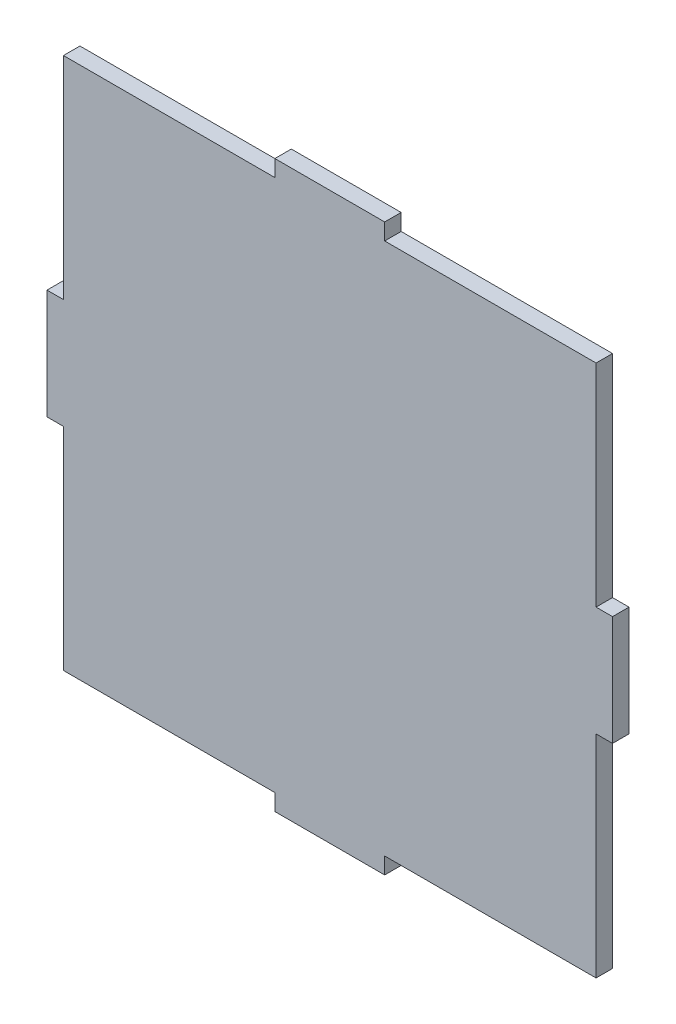
ISO-10303-21;
HEADER;
FILE_DESCRIPTION(('STEP AP214'),'2;1');
FILE_NAME('part.step','',(''),(''),'','','');
FILE_SCHEMA(('AUTOMOTIVE_DESIGN { 1 0 10303 214 1 1 1 1 }'));
ENDSEC;
DATA;
#1=APPLICATION_CONTEXT('core data for automotive mechanical design processes');
#2=APPLICATION_PROTOCOL_DEFINITION('international standard','automotive_design',2000,#1);
#3=PRODUCT_CONTEXT('',#1,'mechanical');
#4=PRODUCT('Part','Part','',(#3));
#5=PRODUCT_RELATED_PRODUCT_CATEGORY('part','',(#4));
#6=PRODUCT_DEFINITION_FORMATION('','',#4);
#7=PRODUCT_DEFINITION_CONTEXT('part definition',#1,'design');
#8=PRODUCT_DEFINITION('design','',#6,#7);
#9=PRODUCT_DEFINITION_SHAPE('','',#8);
#10=(LENGTH_UNIT() NAMED_UNIT(*) SI_UNIT(.MILLI.,.METRE.));
#11=(NAMED_UNIT(*) PLANE_ANGLE_UNIT() SI_UNIT($,.RADIAN.));
#12=(NAMED_UNIT(*) SI_UNIT($,.STERADIAN.) SOLID_ANGLE_UNIT());
#13=UNCERTAINTY_MEASURE_WITH_UNIT(LENGTH_MEASURE(1.E-05),#10,'distance_accuracy_value','');
#14=(GEOMETRIC_REPRESENTATION_CONTEXT(3) GLOBAL_UNCERTAINTY_ASSIGNED_CONTEXT((#13)) GLOBAL_UNIT_ASSIGNED_CONTEXT((#10,
#11,#12)) REPRESENTATION_CONTEXT('',''));
#15=CARTESIAN_POINT('',(0.,0.,0.));
#16=DIRECTION('',(0.,0.,1.));
#17=DIRECTION('',(1.,0.,0.));
#18=AXIS2_PLACEMENT_3D('',#15,#16,#17);
#19=CARTESIAN_POINT('',(60.3280466799532,1.39536638447386E-13,-1.));
#20=DIRECTION('',(-1.,0.,0.));
#21=DIRECTION('',(0.,-1.,0.));
#22=AXIS2_PLACEMENT_3D('',#19,#20,#21);
#23=PLANE('',#22);
#24=DIRECTION('',(0.,0.,1.));
#25=VECTOR('',#24,1.);
#26=CARTESIAN_POINT('',(60.328046679953,101.844291491862,-1.));
#27=LINE('',#26,#25);
#28=CARTESIAN_POINT('',(60.328046679953,101.844291491862,-1.));
#29=VERTEX_POINT('',#28);
#30=CARTESIAN_POINT('',(60.328046679953,101.844291491862,2.));
#31=VERTEX_POINT('',#30);
#32=EDGE_CURVE('E326',#29,#31,#27,.T.);
#33=ORIENTED_EDGE('',*,*,#32,.T.);
#34=DIRECTION('',(0.,-1.,0.));
#35=VECTOR('',#34,1.);
#36=CARTESIAN_POINT('',(60.3280466799532,1.39536638447386E-13,2.));
#37=LINE('',#36,#35);
#38=CARTESIAN_POINT('',(60.328046679953,98.844291491862,2.));
#39=VERTEX_POINT('',#38);
#40=EDGE_CURVE('E456',#31,#39,#37,.T.);
#41=ORIENTED_EDGE('',*,*,#40,.T.);
#42=DIRECTION('',(0.,0.,1.));
#43=VECTOR('',#42,1.);
#44=CARTESIAN_POINT('',(60.328046679953,98.844291491862,-1.));
#45=LINE('',#44,#43);
#46=CARTESIAN_POINT('',(60.328046679953,98.844291491862,-1.));
#47=VERTEX_POINT('',#46);
#48=EDGE_CURVE('E331',#47,#39,#45,.T.);
#49=ORIENTED_EDGE('',*,*,#48,.F.);
#50=DIRECTION('',(0.,-1.,0.));
#51=VECTOR('',#50,1.);
#52=CARTESIAN_POINT('',(60.3280466799532,1.39536638447386E-13,-1.));
#53=LINE('',#52,#51);
#54=EDGE_CURVE('E343',#29,#47,#53,.T.);
#55=ORIENTED_EDGE('',*,*,#54,.F.);
#56=EDGE_LOOP('',(#33,#41,#49,#55));
#57=FACE_BOUND('',#56,.T.);
#58=ADVANCED_FACE('F226',(#57),#23,.F.);
#59=CARTESIAN_POINT('',(40.3280466799527,0.,-1.));
#60=DIRECTION('',(-1.,0.,0.));
#61=DIRECTION('',(0.,-1.,0.));
#62=AXIS2_PLACEMENT_3D('',#59,#60,#61);
#63=PLANE('',#62);
#64=DIRECTION('',(0.,0.,1.));
#65=VECTOR('',#64,1.);
#66=CARTESIAN_POINT('',(40.328046679953,98.844291491862,-1.));
#67=LINE('',#66,#65);
#68=CARTESIAN_POINT('',(40.328046679953,98.844291491862,-1.));
#69=VERTEX_POINT('',#68);
#70=CARTESIAN_POINT('',(40.328046679953,98.844291491862,2.));
#71=VERTEX_POINT('',#70);
#72=EDGE_CURVE('E340',#69,#71,#67,.T.);
#73=ORIENTED_EDGE('',*,*,#72,.T.);
#74=DIRECTION('',(0.,-1.,0.));
#75=VECTOR('',#74,1.);
#76=CARTESIAN_POINT('',(40.3280466799527,0.,2.));
#77=LINE('',#76,#75);
#78=CARTESIAN_POINT('',(40.328046679953,101.844291491862,2.));
#79=VERTEX_POINT('',#78);
#80=EDGE_CURVE('E453',#79,#71,#77,.T.);
#81=ORIENTED_EDGE('',*,*,#80,.F.);
#82=DIRECTION('',(0.,0.,1.));
#83=VECTOR('',#82,1.);
#84=CARTESIAN_POINT('',(40.328046679953,101.844291491862,-1.));
#85=LINE('',#84,#83);
#86=CARTESIAN_POINT('',(40.328046679953,101.844291491862,-1.));
#87=VERTEX_POINT('',#86);
#88=EDGE_CURVE('E348',#87,#79,#85,.T.);
#89=ORIENTED_EDGE('',*,*,#88,.F.);
#90=DIRECTION('',(0.,-1.,0.));
#91=VECTOR('',#90,1.);
#92=CARTESIAN_POINT('',(40.3280466799527,0.,-1.));
#93=LINE('',#92,#91);
#94=EDGE_CURVE('E460',#87,#69,#93,.T.);
#95=ORIENTED_EDGE('',*,*,#94,.T.);
#96=EDGE_LOOP('',(#73,#81,#89,#95));
#97=FACE_BOUND('',#96,.T.);
#98=ADVANCED_FACE('F539',(#97),#63,.T.);
#99=CARTESIAN_POINT('',(0.,101.844291491862,-1.));
#100=DIRECTION('',(0.,1.,0.));
#101=DIRECTION('',(0.,0.,1.));
#102=AXIS2_PLACEMENT_3D('',#99,#100,#101);
#103=PLANE('',#102);
#104=ORIENTED_EDGE('',*,*,#88,.T.);
#105=DIRECTION('',(-1.,0.,0.));
#106=VECTOR('',#105,1.);
#107=CARTESIAN_POINT('',(0.,101.844291491862,2.));
#108=LINE('',#107,#106);
#109=EDGE_CURVE('E443',#31,#79,#108,.T.);
#110=ORIENTED_EDGE('',*,*,#109,.F.);
#111=ORIENTED_EDGE('',*,*,#32,.F.);
#112=DIRECTION('',(-1.,0.,0.));
#113=VECTOR('',#112,1.);
#114=CARTESIAN_POINT('',(0.,101.844291491862,-1.));
#115=LINE('',#114,#113);
#116=EDGE_CURVE('E458',#29,#87,#115,.T.);
#117=ORIENTED_EDGE('',*,*,#116,.T.);
#118=EDGE_LOOP('',(#104,#110,#111,#117));
#119=FACE_BOUND('',#118,.T.);
#120=ADVANCED_FACE('F538',(#119),#103,.T.);
#121=CARTESIAN_POINT('',(1.82804667995323,98.844291491862,2.));
#122=DIRECTION('',(0.,1.,0.));
#123=DIRECTION('',(-1.,0.,0.));
#124=AXIS2_PLACEMENT_3D('',#121,#122,#123);
#125=PLANE('',#124);
#126=ORIENTED_EDGE('',*,*,#48,.T.);
#127=DIRECTION('',(1.,0.,0.));
#128=VECTOR('',#127,1.);
#129=CARTESIAN_POINT('',(1.82804667995323,98.844291491862,2.));
#130=LINE('',#129,#128);
#131=CARTESIAN_POINT('',(98.8280466799527,98.8442914918619,2.));
#132=VERTEX_POINT('',#131);
#133=EDGE_CURVE('E435',#39,#132,#130,.T.);
#134=ORIENTED_EDGE('',*,*,#133,.T.);
#135=DIRECTION('',(0.,0.,-1.));
#136=VECTOR('',#135,1.);
#137=CARTESIAN_POINT('',(98.8280466799527,98.8442914918619,2.));
#138=LINE('',#137,#136);
#139=CARTESIAN_POINT('',(98.8280466799527,98.8442914918619,-1.));
#140=VERTEX_POINT('',#139);
#141=EDGE_CURVE('E440',#132,#140,#138,.T.);
#142=ORIENTED_EDGE('',*,*,#141,.T.);
#143=DIRECTION('',(1.,0.,0.));
#144=VECTOR('',#143,1.);
#145=CARTESIAN_POINT('',(1.82804667995323,98.844291491862,-1.));
#146=LINE('',#145,#144);
#147=EDGE_CURVE('E419',#47,#140,#146,.T.);
#148=ORIENTED_EDGE('',*,*,#147,.F.);
#149=EDGE_LOOP('',(#126,#134,#142,#148));
#150=FACE_BOUND('',#149,.T.);
#151=ADVANCED_FACE('F480',(#150),#125,.T.);
#152=CARTESIAN_POINT('',(1.82804667995323,98.844291491862,2.));
#153=VERTEX_POINT('',#152);
#154=EDGE_CURVE('E436',#153,#71,#130,.T.);
#155=ORIENTED_EDGE('',*,*,#154,.T.);
#156=ORIENTED_EDGE('',*,*,#72,.F.);
#157=CARTESIAN_POINT('',(1.82804667995323,98.844291491862,-1.));
#158=VERTEX_POINT('',#157);
#159=EDGE_CURVE('E420',#158,#69,#146,.T.);
#160=ORIENTED_EDGE('',*,*,#159,.F.);
#161=DIRECTION('',(0.,0.,-1.));
#162=VECTOR('',#161,1.);
#163=CARTESIAN_POINT('',(1.82804667995323,98.844291491862,2.));
#164=LINE('',#163,#162);
#165=EDGE_CURVE('E444',#153,#158,#164,.T.);
#166=ORIENTED_EDGE('',*,*,#165,.F.);
#167=EDGE_LOOP('',(#155,#156,#160,#166));
#168=FACE_BOUND('',#167,.T.);
#169=ADVANCED_FACE('F603',(#168),#125,.T.);
#170=CARTESIAN_POINT('',(1.82804667995323,98.844291491862,2.));
#171=DIRECTION('',(1.,0.,0.));
#172=DIRECTION('',(0.,1.,0.));
#173=AXIS2_PLACEMENT_3D('',#170,#171,#172);
#174=PLANE('',#173);
#175=DIRECTION('',(0.,0.,1.));
#176=VECTOR('',#175,1.);
#177=CARTESIAN_POINT('',(1.82804667995317,40.3442914918618,-1.));
#178=LINE('',#177,#176);
#179=CARTESIAN_POINT('',(1.82804667995317,40.3442914918618,-1.));
#180=VERTEX_POINT('',#179);
#181=CARTESIAN_POINT('',(1.82804667995317,40.3442914918618,2.));
#182=VERTEX_POINT('',#181);
#183=EDGE_CURVE('E323',#180,#182,#178,.T.);
#184=ORIENTED_EDGE('',*,*,#183,.F.);
#185=DIRECTION('',(0.,-1.,0.));
#186=VECTOR('',#185,1.);
#187=CARTESIAN_POINT('',(1.82804667995323,98.844291491862,-1.));
#188=LINE('',#187,#186);
#189=CARTESIAN_POINT('',(1.82804667995313,1.84429149186213,-1.));
#190=VERTEX_POINT('',#189);
#191=EDGE_CURVE('E409',#180,#190,#188,.T.);
#192=ORIENTED_EDGE('',*,*,#191,.T.);
#193=DIRECTION('',(0.,0.,-1.));
#194=VECTOR('',#193,1.);
#195=CARTESIAN_POINT('',(1.82804667995313,1.84429149186213,2.));
#196=LINE('',#195,#194);
#197=CARTESIAN_POINT('',(1.82804667995313,1.84429149186213,2.));
#198=VERTEX_POINT('',#197);
#199=EDGE_CURVE('E447',#198,#190,#196,.T.);
#200=ORIENTED_EDGE('',*,*,#199,.F.);
#201=DIRECTION('',(0.,-1.,0.));
#202=VECTOR('',#201,1.);
#203=CARTESIAN_POINT('',(1.82804667995323,98.844291491862,2.));
#204=LINE('',#203,#202);
#205=EDGE_CURVE('E431',#182,#198,#204,.T.);
#206=ORIENTED_EDGE('',*,*,#205,.F.);
#207=EDGE_LOOP('',(#184,#192,#200,#206));
#208=FACE_BOUND('',#207,.T.);
#209=ADVANCED_FACE('F598',(#208),#174,.F.);
#210=CARTESIAN_POINT('',(0.,0.,2.));
#211=DIRECTION('',(0.,0.,1.));
#212=DIRECTION('',(1.,0.,0.));
#213=AXIS2_PLACEMENT_3D('',#210,#211,#212);
#214=PLANE('',#213);
#215=ORIENTED_EDGE('',*,*,#109,.T.);
#216=ORIENTED_EDGE('',*,*,#80,.T.);
#217=ORIENTED_EDGE('',*,*,#154,.F.);
#218=CARTESIAN_POINT('',(1.82804667995319,60.3442914918618,2.));
#219=VERTEX_POINT('',#218);
#220=EDGE_CURVE('E432',#153,#219,#204,.T.);
#221=ORIENTED_EDGE('',*,*,#220,.T.);
#222=DIRECTION('',(-1.,0.,0.));
#223=VECTOR('',#222,1.);
#224=CARTESIAN_POINT('',(1.39574212122827E-13,60.3442914918618,2.));
#225=LINE('',#224,#223);
#226=CARTESIAN_POINT('',(-1.17195332004687,60.3442914918618,2.));
#227=VERTEX_POINT('',#226);
#228=EDGE_CURVE('E351',#219,#227,#225,.T.);
#229=ORIENTED_EDGE('',*,*,#228,.T.);
#230=DIRECTION('',(0.,-1.,0.));
#231=VECTOR('',#230,1.);
#232=CARTESIAN_POINT('',(-1.17195332004683,0.,2.));
#233=LINE('',#232,#231);
#234=CARTESIAN_POINT('',(-1.17195332004685,40.3442914918618,2.));
#235=VERTEX_POINT('',#234);
#236=EDGE_CURVE('E354',#227,#235,#233,.T.);
#237=ORIENTED_EDGE('',*,*,#236,.T.);
#238=DIRECTION('',(-1.,0.,0.));
#239=VECTOR('',#238,1.);
#240=CARTESIAN_POINT('',(0.,40.3442914918618,2.));
#241=LINE('',#240,#239);
#242=EDGE_CURVE('E358',#182,#235,#241,.T.);
#243=ORIENTED_EDGE('',*,*,#242,.F.);
#244=ORIENTED_EDGE('',*,*,#205,.T.);
#245=DIRECTION('',(-1.,0.,0.));
#246=VECTOR('',#245,1.);
#247=CARTESIAN_POINT('',(98.8280466799529,1.84429149186167,2.));
#248=LINE('',#247,#246);
#249=CARTESIAN_POINT('',(40.3280466799529,1.84429149186195,2.));
#250=VERTEX_POINT('',#249);
#251=EDGE_CURVE('E427',#250,#198,#248,.T.);
#252=ORIENTED_EDGE('',*,*,#251,.F.);
#253=DIRECTION('',(0.,1.,0.));
#254=VECTOR('',#253,1.);
#255=CARTESIAN_POINT('',(40.3280466799529,0.,2.));
#256=LINE('',#255,#254);
#257=CARTESIAN_POINT('',(40.3280466799529,-1.15570850813781,2.));
#258=VERTEX_POINT('',#257);
#259=EDGE_CURVE('E311',#258,#250,#256,.T.);
#260=ORIENTED_EDGE('',*,*,#259,.F.);
#261=DIRECTION('',(-1.,0.,0.));
#262=VECTOR('',#261,1.);
#263=CARTESIAN_POINT('',(0.,-1.15570850813781,2.));
#264=LINE('',#263,#262);
#265=CARTESIAN_POINT('',(60.3280466799529,-1.15570850813781,2.));
#266=VERTEX_POINT('',#265);
#267=EDGE_CURVE('E314',#266,#258,#264,.T.);
#268=ORIENTED_EDGE('',*,*,#267,.F.);
#269=DIRECTION('',(0.,1.,0.));
#270=VECTOR('',#269,1.);
#271=CARTESIAN_POINT('',(60.3280466799529,-1.39536638447385E-13,2.));
#272=LINE('',#271,#270);
#273=CARTESIAN_POINT('',(60.3280466799529,1.84429149186185,2.));
#274=VERTEX_POINT('',#273);
#275=EDGE_CURVE('E396',#266,#274,#272,.T.);
#276=ORIENTED_EDGE('',*,*,#275,.T.);
#277=CARTESIAN_POINT('',(98.8280466799529,1.84429149186167,2.));
#278=VERTEX_POINT('',#277);
#279=EDGE_CURVE('E428',#278,#274,#248,.T.);
#280=ORIENTED_EDGE('',*,*,#279,.F.);
#281=DIRECTION('',(0.,-1.,0.));
#282=VECTOR('',#281,1.);
#283=CARTESIAN_POINT('',(98.8280466799527,98.8442914918619,2.));
#284=LINE('',#283,#282);
#285=CARTESIAN_POINT('',(98.8280466799528,40.3442914918618,2.));
#286=VERTEX_POINT('',#285);
#287=EDGE_CURVE('E423',#286,#278,#284,.T.);
#288=ORIENTED_EDGE('',*,*,#287,.F.);
#289=DIRECTION('',(1.,0.,0.));
#290=VECTOR('',#289,1.);
#291=CARTESIAN_POINT('',(0.,40.3442914918618,2.));
#292=LINE('',#291,#290);
#293=CARTESIAN_POINT('',(101.828046679953,40.3442914918618,2.));
#294=VERTEX_POINT('',#293);
#295=EDGE_CURVE('E381',#286,#294,#292,.T.);
#296=ORIENTED_EDGE('',*,*,#295,.T.);
#297=DIRECTION('',(0.,-1.,0.));
#298=VECTOR('',#297,1.);
#299=CARTESIAN_POINT('',(101.828046679953,0.,2.));
#300=LINE('',#299,#298);
#301=CARTESIAN_POINT('',(101.828046679953,60.3442914918618,2.));
#302=VERTEX_POINT('',#301);
#303=EDGE_CURVE('E316',#302,#294,#300,.T.);
#304=ORIENTED_EDGE('',*,*,#303,.F.);
#305=DIRECTION('',(1.,0.,0.));
#306=VECTOR('',#305,1.);
#307=CARTESIAN_POINT('',(-1.39574212122827E-13,60.3442914918616,2.));
#308=LINE('',#307,#306);
#309=CARTESIAN_POINT('',(98.8280466799528,60.3442914918618,2.));
#310=VERTEX_POINT('',#309);
#311=EDGE_CURVE('E319',#310,#302,#308,.T.);
#312=ORIENTED_EDGE('',*,*,#311,.F.);
#313=EDGE_CURVE('E424',#132,#310,#284,.T.);
#314=ORIENTED_EDGE('',*,*,#313,.F.);
#315=ORIENTED_EDGE('',*,*,#133,.F.);
#316=ORIENTED_EDGE('',*,*,#40,.F.);
#317=EDGE_LOOP('',(#215,#216,#217,#221,#229,#237,#243,#244,#252,#260,#268,#276,#280,#288,#296,
#304,#312,#314,#315,#316));
#318=FACE_BOUND('',#317,.T.);
#319=ADVANCED_FACE('F542',(#318),#214,.T.);
#320=CARTESIAN_POINT('',(98.8280466799527,98.8442914918619,2.));
#321=DIRECTION('',(1.,0.,0.));
#322=DIRECTION('',(0.,1.,0.));
#323=AXIS2_PLACEMENT_3D('',#320,#321,#322);
#324=PLANE('',#323);
#325=DIRECTION('',(0.,-1.,0.));
#326=VECTOR('',#325,1.);
#327=CARTESIAN_POINT('',(98.8280466799527,98.8442914918619,-1.));
#328=LINE('',#327,#326);
#329=CARTESIAN_POINT('',(98.8280466799528,40.3442914918618,-1.));
#330=VERTEX_POINT('',#329);
#331=CARTESIAN_POINT('',(98.8280466799529,1.84429149186167,-1.));
#332=VERTEX_POINT('',#331);
#333=EDGE_CURVE('E375',#330,#332,#328,.T.);
#334=ORIENTED_EDGE('',*,*,#333,.F.);
#335=DIRECTION('',(0.,0.,1.));
#336=VECTOR('',#335,1.);
#337=CARTESIAN_POINT('',(98.8280466799528,40.3442914918618,-1.));
#338=LINE('',#337,#336);
#339=EDGE_CURVE('E12',#330,#286,#338,.T.);
#340=ORIENTED_EDGE('',*,*,#339,.T.);
#341=ORIENTED_EDGE('',*,*,#287,.T.);
#342=DIRECTION('',(0.,0.,-1.));
#343=VECTOR('',#342,1.);
#344=CARTESIAN_POINT('',(98.8280466799529,1.84429149186167,2.));
#345=LINE('',#344,#343);
#346=EDGE_CURVE('E439',#278,#332,#345,.T.);
#347=ORIENTED_EDGE('',*,*,#346,.T.);
#348=EDGE_LOOP('',(#334,#340,#341,#347));
#349=FACE_BOUND('',#348,.T.);
#350=ADVANCED_FACE('F515',(#349),#324,.T.);
#351=CARTESIAN_POINT('',(0.,0.,-1.));
#352=DIRECTION('',(0.,0.,1.));
#353=DIRECTION('',(1.,0.,0.));
#354=AXIS2_PLACEMENT_3D('',#351,#352,#353);
#355=PLANE('',#354);
#356=ORIENTED_EDGE('',*,*,#116,.F.);
#357=ORIENTED_EDGE('',*,*,#54,.T.);
#358=ORIENTED_EDGE('',*,*,#147,.T.);
#359=CARTESIAN_POINT('',(98.8280466799528,60.3442914918618,-1.));
#360=VERTEX_POINT('',#359);
#361=EDGE_CURVE('E415',#140,#360,#328,.T.);
#362=ORIENTED_EDGE('',*,*,#361,.T.);
#363=DIRECTION('',(1.,0.,0.));
#364=VECTOR('',#363,1.);
#365=CARTESIAN_POINT('',(-1.39574212122827E-13,60.3442914918616,-1.));
#366=LINE('',#365,#364);
#367=CARTESIAN_POINT('',(101.828046679953,60.3442914918618,-1.));
#368=VERTEX_POINT('',#367);
#369=EDGE_CURVE('E386',#360,#368,#366,.T.);
#370=ORIENTED_EDGE('',*,*,#369,.T.);
#371=DIRECTION('',(0.,-1.,0.));
#372=VECTOR('',#371,1.);
#373=CARTESIAN_POINT('',(101.828046679953,0.,-1.));
#374=LINE('',#373,#372);
#375=CARTESIAN_POINT('',(101.828046679953,40.3442914918618,-1.));
#376=VERTEX_POINT('',#375);
#377=EDGE_CURVE('E384',#368,#376,#374,.T.);
#378=ORIENTED_EDGE('',*,*,#377,.T.);
#379=DIRECTION('',(1.,0.,0.));
#380=VECTOR('',#379,1.);
#381=CARTESIAN_POINT('',(0.,40.3442914918618,-1.));
#382=LINE('',#381,#380);
#383=EDGE_CURVE('E388',#330,#376,#382,.T.);
#384=ORIENTED_EDGE('',*,*,#383,.F.);
#385=ORIENTED_EDGE('',*,*,#333,.T.);
#386=DIRECTION('',(-1.,0.,0.));
#387=VECTOR('',#386,1.);
#388=CARTESIAN_POINT('',(98.8280466799529,1.84429149186167,-1.));
#389=LINE('',#388,#387);
#390=CARTESIAN_POINT('',(60.3280466799529,1.84429149186185,-1.));
#391=VERTEX_POINT('',#390);
#392=EDGE_CURVE('E404',#332,#391,#389,.T.);
#393=ORIENTED_EDGE('',*,*,#392,.T.);
#394=DIRECTION('',(0.,1.,0.));
#395=VECTOR('',#394,1.);
#396=CARTESIAN_POINT('',(60.3280466799529,-1.39536638447385E-13,-1.));
#397=LINE('',#396,#395);
#398=CARTESIAN_POINT('',(60.3280466799529,-1.15570850813781,-1.));
#399=VERTEX_POINT('',#398);
#400=EDGE_CURVE('E303',#399,#391,#397,.T.);
#401=ORIENTED_EDGE('',*,*,#400,.F.);
#402=DIRECTION('',(-1.,0.,0.));
#403=VECTOR('',#402,1.);
#404=CARTESIAN_POINT('',(0.,-1.15570850813781,-1.));
#405=LINE('',#404,#403);
#406=CARTESIAN_POINT('',(40.3280466799529,-1.15570850813781,-1.));
#407=VERTEX_POINT('',#406);
#408=EDGE_CURVE('E306',#399,#407,#405,.T.);
#409=ORIENTED_EDGE('',*,*,#408,.T.);
#410=DIRECTION('',(0.,1.,0.));
#411=VECTOR('',#410,1.);
#412=CARTESIAN_POINT('',(40.3280466799529,0.,-1.));
#413=LINE('',#412,#411);
#414=CARTESIAN_POINT('',(40.3280466799529,1.84429149186195,-1.));
#415=VERTEX_POINT('',#414);
#416=EDGE_CURVE('E290',#407,#415,#413,.T.);
#417=ORIENTED_EDGE('',*,*,#416,.T.);
#418=EDGE_CURVE('E410',#415,#190,#389,.T.);
#419=ORIENTED_EDGE('',*,*,#418,.T.);
#420=ORIENTED_EDGE('',*,*,#191,.F.);
#421=DIRECTION('',(-1.,0.,0.));
#422=VECTOR('',#421,1.);
#423=CARTESIAN_POINT('',(0.,40.3442914918618,-1.));
#424=LINE('',#423,#422);
#425=CARTESIAN_POINT('',(-1.17195332004685,40.3442914918618,-1.));
#426=VERTEX_POINT('',#425);
#427=EDGE_CURVE('E367',#180,#426,#424,.T.);
#428=ORIENTED_EDGE('',*,*,#427,.T.);
#429=DIRECTION('',(0.,-1.,0.));
#430=VECTOR('',#429,1.);
#431=CARTESIAN_POINT('',(-1.17195332004683,0.,-1.));
#432=LINE('',#431,#430);
#433=CARTESIAN_POINT('',(-1.17195332004687,60.3442914918618,-1.));
#434=VERTEX_POINT('',#433);
#435=EDGE_CURVE('E364',#434,#426,#432,.T.);
#436=ORIENTED_EDGE('',*,*,#435,.F.);
#437=DIRECTION('',(-1.,0.,0.));
#438=VECTOR('',#437,1.);
#439=CARTESIAN_POINT('',(1.39574212122827E-13,60.3442914918618,-1.));
#440=LINE('',#439,#438);
#441=CARTESIAN_POINT('',(1.82804667995319,60.3442914918618,-1.));
#442=VERTEX_POINT('',#441);
#443=EDGE_CURVE('E361',#442,#434,#440,.T.);
#444=ORIENTED_EDGE('',*,*,#443,.F.);
#445=EDGE_CURVE('E413',#158,#442,#188,.T.);
#446=ORIENTED_EDGE('',*,*,#445,.F.);
#447=ORIENTED_EDGE('',*,*,#159,.T.);
#448=ORIENTED_EDGE('',*,*,#94,.F.);
#449=EDGE_LOOP('',(#356,#357,#358,#362,#370,#378,#384,#385,#393,#401,#409,#417,#419,#420,#428,
#436,#444,#446,#447,#448));
#450=FACE_BOUND('',#449,.T.);
#451=ADVANCED_FACE('F308',(#450),#355,.F.);
#452=CARTESIAN_POINT('',(98.8280466799529,1.84429149186167,2.));
#453=DIRECTION('',(0.,-1.,0.));
#454=DIRECTION('',(1.,0.,0.));
#455=AXIS2_PLACEMENT_3D('',#452,#453,#454);
#456=PLANE('',#455);
#457=DIRECTION('',(0.,0.,1.));
#458=VECTOR('',#457,1.);
#459=CARTESIAN_POINT('',(60.3280466799529,1.84429149186185,-1.));
#460=LINE('',#459,#458);
#461=EDGE_CURVE('E324',#391,#274,#460,.T.);
#462=ORIENTED_EDGE('',*,*,#461,.F.);
#463=ORIENTED_EDGE('',*,*,#392,.F.);
#464=ORIENTED_EDGE('',*,*,#346,.F.);
#465=ORIENTED_EDGE('',*,*,#279,.T.);
#466=EDGE_LOOP('',(#462,#463,#464,#465));
#467=FACE_BOUND('',#466,.T.);
#468=ADVANCED_FACE('F550',(#467),#456,.T.);
#469=ORIENTED_EDGE('',*,*,#418,.F.);
#470=DIRECTION('',(0.,0.,1.));
#471=VECTOR('',#470,1.);
#472=CARTESIAN_POINT('',(40.3280466799529,1.84429149186195,-1.));
#473=LINE('',#472,#471);
#474=EDGE_CURVE('E299',#415,#250,#473,.T.);
#475=ORIENTED_EDGE('',*,*,#474,.T.);
#476=ORIENTED_EDGE('',*,*,#251,.T.);
#477=ORIENTED_EDGE('',*,*,#199,.T.);
#478=EDGE_LOOP('',(#469,#475,#476,#477));
#479=FACE_BOUND('',#478,.T.);
#480=ADVANCED_FACE('F552',(#479),#456,.T.);
#481=ORIENTED_EDGE('',*,*,#445,.T.);
#482=DIRECTION('',(0.,0.,1.));
#483=VECTOR('',#482,1.);
#484=CARTESIAN_POINT('',(1.82804667995319,60.3442914918618,-1.));
#485=LINE('',#484,#483);
#486=EDGE_CURVE('E372',#442,#219,#485,.T.);
#487=ORIENTED_EDGE('',*,*,#486,.T.);
#488=ORIENTED_EDGE('',*,*,#220,.F.);
#489=ORIENTED_EDGE('',*,*,#165,.T.);
#490=EDGE_LOOP('',(#481,#487,#488,#489));
#491=FACE_BOUND('',#490,.T.);
#492=ADVANCED_FACE('F558',(#491),#174,.F.);
#493=DIRECTION('',(0.,0.,1.));
#494=VECTOR('',#493,1.);
#495=CARTESIAN_POINT('',(98.8280466799528,60.3442914918618,-1.));
#496=LINE('',#495,#494);
#497=EDGE_CURVE('E236',#360,#310,#496,.T.);
#498=ORIENTED_EDGE('',*,*,#497,.F.);
#499=ORIENTED_EDGE('',*,*,#361,.F.);
#500=ORIENTED_EDGE('',*,*,#141,.F.);
#501=ORIENTED_EDGE('',*,*,#313,.T.);
#502=EDGE_LOOP('',(#498,#499,#500,#501));
#503=FACE_BOUND('',#502,.T.);
#504=ADVANCED_FACE('F520',(#503),#324,.T.);
#505=CARTESIAN_POINT('',(0.,-1.15570850813781,-1.));
#506=DIRECTION('',(0.,1.,0.));
#507=DIRECTION('',(0.,0.,1.));
#508=AXIS2_PLACEMENT_3D('',#505,#506,#507);
#509=PLANE('',#508);
#510=DIRECTION('',(0.,0.,1.));
#511=VECTOR('',#510,1.);
#512=CARTESIAN_POINT('',(60.3280466799529,-1.15570850813781,-1.));
#513=LINE('',#512,#511);
#514=EDGE_CURVE('E230',#399,#266,#513,.T.);
#515=ORIENTED_EDGE('',*,*,#514,.T.);
#516=ORIENTED_EDGE('',*,*,#267,.T.);
#517=DIRECTION('',(0.,0.,1.));
#518=VECTOR('',#517,1.);
#519=CARTESIAN_POINT('',(40.3280466799529,-1.15570850813781,-1.));
#520=LINE('',#519,#518);
#521=EDGE_CURVE('E295',#407,#258,#520,.T.);
#522=ORIENTED_EDGE('',*,*,#521,.F.);
#523=ORIENTED_EDGE('',*,*,#408,.F.);
#524=EDGE_LOOP('',(#515,#516,#522,#523));
#525=FACE_BOUND('',#524,.T.);
#526=ADVANCED_FACE('F228',(#525),#509,.F.);
#527=CARTESIAN_POINT('',(60.3280466799529,-1.39536638447385E-13,-1.));
#528=DIRECTION('',(1.,0.,0.));
#529=DIRECTION('',(0.,1.,0.));
#530=AXIS2_PLACEMENT_3D('',#527,#528,#529);
#531=PLANE('',#530);
#532=ORIENTED_EDGE('',*,*,#461,.T.);
#533=ORIENTED_EDGE('',*,*,#275,.F.);
#534=ORIENTED_EDGE('',*,*,#514,.F.);
#535=ORIENTED_EDGE('',*,*,#400,.T.);
#536=EDGE_LOOP('',(#532,#533,#534,#535));
#537=FACE_BOUND('',#536,.T.);
#538=ADVANCED_FACE('F399',(#537),#531,.T.);
#539=CARTESIAN_POINT('',(40.3280466799529,0.,-1.));
#540=DIRECTION('',(1.,0.,0.));
#541=DIRECTION('',(0.,1.,0.));
#542=AXIS2_PLACEMENT_3D('',#539,#540,#541);
#543=PLANE('',#542);
#544=ORIENTED_EDGE('',*,*,#521,.T.);
#545=ORIENTED_EDGE('',*,*,#259,.T.);
#546=ORIENTED_EDGE('',*,*,#474,.F.);
#547=ORIENTED_EDGE('',*,*,#416,.F.);
#548=EDGE_LOOP('',(#544,#545,#546,#547));
#549=FACE_BOUND('',#548,.T.);
#550=ADVANCED_FACE('F292',(#549),#543,.F.);
#551=CARTESIAN_POINT('',(-1.17195332004683,0.,-1.));
#552=DIRECTION('',(-1.,0.,0.));
#553=DIRECTION('',(0.,-1.,0.));
#554=AXIS2_PLACEMENT_3D('',#551,#552,#553);
#555=PLANE('',#554);
#556=DIRECTION('',(0.,0.,1.));
#557=VECTOR('',#556,1.);
#558=CARTESIAN_POINT('',(-1.17195332004685,40.3442914918618,-1.));
#559=LINE('',#558,#557);
#560=EDGE_CURVE('E373',#426,#235,#559,.T.);
#561=ORIENTED_EDGE('',*,*,#560,.T.);
#562=ORIENTED_EDGE('',*,*,#236,.F.);
#563=DIRECTION('',(0.,0.,1.));
#564=VECTOR('',#563,1.);
#565=CARTESIAN_POINT('',(-1.17195332004687,60.3442914918618,-1.));
#566=LINE('',#565,#564);
#567=EDGE_CURVE('E369',#434,#227,#566,.T.);
#568=ORIENTED_EDGE('',*,*,#567,.F.);
#569=ORIENTED_EDGE('',*,*,#435,.T.);
#570=EDGE_LOOP('',(#561,#562,#568,#569));
#571=FACE_BOUND('',#570,.T.);
#572=ADVANCED_FACE('F570',(#571),#555,.T.);
#573=CARTESIAN_POINT('',(0.,40.3442914918618,-1.));
#574=DIRECTION('',(0.,1.,0.));
#575=DIRECTION('',(0.,0.,1.));
#576=AXIS2_PLACEMENT_3D('',#573,#574,#575);
#577=PLANE('',#576);
#578=ORIENTED_EDGE('',*,*,#183,.T.);
#579=ORIENTED_EDGE('',*,*,#242,.T.);
#580=ORIENTED_EDGE('',*,*,#560,.F.);
#581=ORIENTED_EDGE('',*,*,#427,.F.);
#582=EDGE_LOOP('',(#578,#579,#580,#581));
#583=FACE_BOUND('',#582,.T.);
#584=ADVANCED_FACE('F568',(#583),#577,.F.);
#585=CARTESIAN_POINT('',(1.39574212122827E-13,60.3442914918618,-1.));
#586=DIRECTION('',(0.,1.,0.));
#587=DIRECTION('',(-1.,0.,0.));
#588=AXIS2_PLACEMENT_3D('',#585,#586,#587);
#589=PLANE('',#588);
#590=ORIENTED_EDGE('',*,*,#567,.T.);
#591=ORIENTED_EDGE('',*,*,#228,.F.);
#592=ORIENTED_EDGE('',*,*,#486,.F.);
#593=ORIENTED_EDGE('',*,*,#443,.T.);
#594=EDGE_LOOP('',(#590,#591,#592,#593));
#595=FACE_BOUND('',#594,.T.);
#596=ADVANCED_FACE('F577',(#595),#589,.T.);
#597=CARTESIAN_POINT('',(101.828046679953,0.,-1.));
#598=DIRECTION('',(-1.,0.,0.));
#599=DIRECTION('',(0.,0.,1.));
#600=AXIS2_PLACEMENT_3D('',#597,#598,#599);
#601=PLANE('',#600);
#602=DIRECTION('',(0.,0.,1.));
#603=VECTOR('',#602,1.);
#604=CARTESIAN_POINT('',(101.828046679953,60.3442914918618,-1.));
#605=LINE('',#604,#603);
#606=EDGE_CURVE('E391',#368,#302,#605,.T.);
#607=ORIENTED_EDGE('',*,*,#606,.T.);
#608=ORIENTED_EDGE('',*,*,#303,.T.);
#609=DIRECTION('',(0.,0.,1.));
#610=VECTOR('',#609,1.);
#611=CARTESIAN_POINT('',(101.828046679953,40.3442914918618,-1.));
#612=LINE('',#611,#610);
#613=EDGE_CURVE('E355',#376,#294,#612,.T.);
#614=ORIENTED_EDGE('',*,*,#613,.F.);
#615=ORIENTED_EDGE('',*,*,#377,.F.);
#616=EDGE_LOOP('',(#607,#608,#614,#615));
#617=FACE_BOUND('',#616,.T.);
#618=ADVANCED_FACE('F548',(#617),#601,.F.);
#619=CARTESIAN_POINT('',(-1.39574212122827E-13,60.3442914918616,-1.));
#620=DIRECTION('',(0.,-1.,0.));
#621=DIRECTION('',(1.,0.,0.));
#622=AXIS2_PLACEMENT_3D('',#619,#620,#621);
#623=PLANE('',#622);
#624=ORIENTED_EDGE('',*,*,#497,.T.);
#625=ORIENTED_EDGE('',*,*,#311,.T.);
#626=ORIENTED_EDGE('',*,*,#606,.F.);
#627=ORIENTED_EDGE('',*,*,#369,.F.);
#628=EDGE_LOOP('',(#624,#625,#626,#627));
#629=FACE_BOUND('',#628,.T.);
#630=ADVANCED_FACE('F546',(#629),#623,.F.);
#631=CARTESIAN_POINT('',(0.,40.3442914918618,-1.));
#632=DIRECTION('',(0.,-1.,0.));
#633=DIRECTION('',(0.,0.,-1.));
#634=AXIS2_PLACEMENT_3D('',#631,#632,#633);
#635=PLANE('',#634);
#636=ORIENTED_EDGE('',*,*,#613,.T.);
#637=ORIENTED_EDGE('',*,*,#295,.F.);
#638=ORIENTED_EDGE('',*,*,#339,.F.);
#639=ORIENTED_EDGE('',*,*,#383,.T.);
#640=EDGE_LOOP('',(#636,#637,#638,#639));
#641=FACE_BOUND('',#640,.T.);
#642=ADVANCED_FACE('F511',(#641),#635,.T.);
#643=CLOSED_SHELL('',(#58,#98,#120,#151,#169,#209,#319,#350,#451,#468,#480,#492,#504,#526,#538,
#550,#572,#584,#596,#618,#630,#642));
#644=MANIFOLD_SOLID_BREP('B2',#643);
#645=ADVANCED_BREP_SHAPE_REPRESENTATION('',(#18,#644),#14);
#646=SHAPE_DEFINITION_REPRESENTATION(#9,#645);
ENDSEC;
END-ISO-10303-21;
